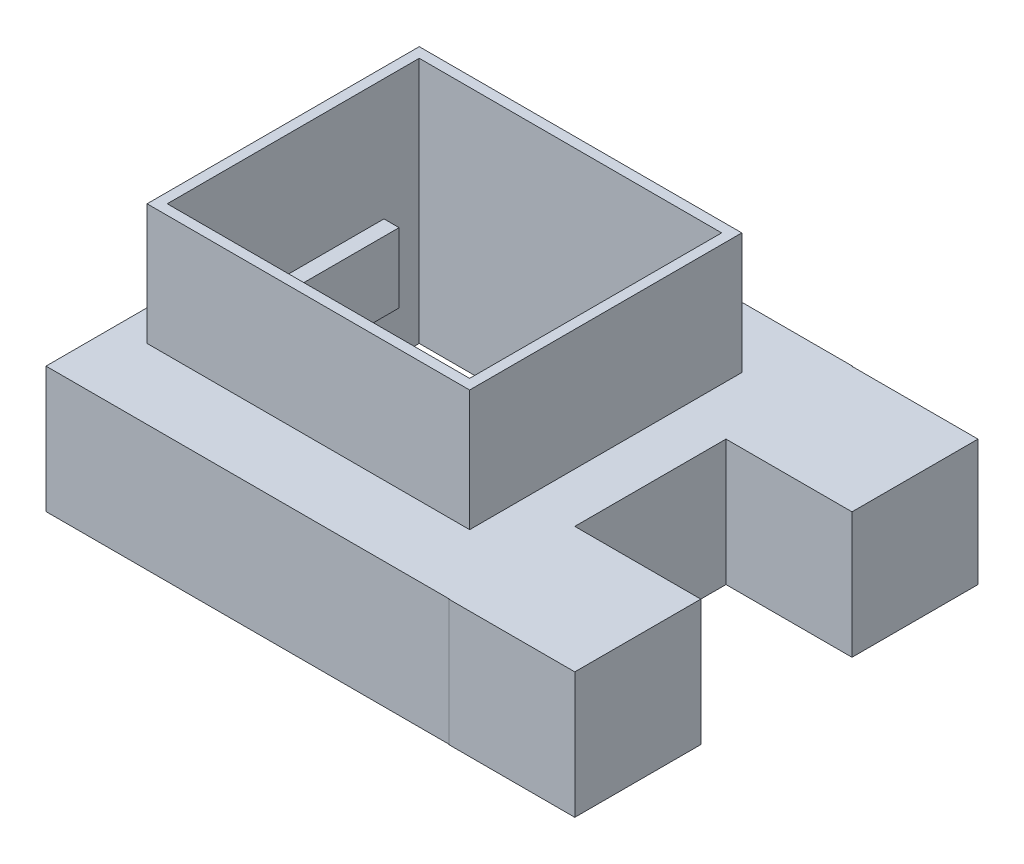
ISO-10303-21;
HEADER;
FILE_DESCRIPTION(('STEP AP214'),'2;1');
FILE_NAME('part.step','',(''),(''),'','','');
FILE_SCHEMA(('AUTOMOTIVE_DESIGN { 1 0 10303 214 1 1 1 1 }'));
ENDSEC;
DATA;
#1=APPLICATION_CONTEXT('core data for automotive mechanical design processes');
#2=APPLICATION_PROTOCOL_DEFINITION('international standard','automotive_design',2000,#1);
#3=PRODUCT_CONTEXT('',#1,'mechanical');
#4=PRODUCT('Part','Part','',(#3));
#5=PRODUCT_RELATED_PRODUCT_CATEGORY('part','',(#4));
#6=PRODUCT_DEFINITION_FORMATION('','',#4);
#7=PRODUCT_DEFINITION_CONTEXT('part definition',#1,'design');
#8=PRODUCT_DEFINITION('design','',#6,#7);
#9=PRODUCT_DEFINITION_SHAPE('','',#8);
#10=(LENGTH_UNIT() NAMED_UNIT(*) SI_UNIT(.MILLI.,.METRE.));
#11=(NAMED_UNIT(*) PLANE_ANGLE_UNIT() SI_UNIT($,.RADIAN.));
#12=(NAMED_UNIT(*) SI_UNIT($,.STERADIAN.) SOLID_ANGLE_UNIT());
#13=UNCERTAINTY_MEASURE_WITH_UNIT(LENGTH_MEASURE(1.E-05),#10,'distance_accuracy_value','');
#14=(GEOMETRIC_REPRESENTATION_CONTEXT(3) GLOBAL_UNCERTAINTY_ASSIGNED_CONTEXT((#13)) GLOBAL_UNIT_ASSIGNED_CONTEXT((#10,
#11,#12)) REPRESENTATION_CONTEXT('',''));
#15=CARTESIAN_POINT('',(0.,0.,0.));
#16=DIRECTION('',(0.,0.,1.));
#17=DIRECTION('',(1.,0.,0.));
#18=AXIS2_PLACEMENT_3D('',#15,#16,#17);
#19=CARTESIAN_POINT('',(-1121.59614728225,739.858247896649,-1949.43739785231));
#20=DIRECTION('',(-1.,0.,0.));
#21=DIRECTION('',(0.,0.,1.));
#22=AXIS2_PLACEMENT_3D('',#19,#20,#21);
#23=PLANE('',#22);
#24=DIRECTION('',(0.,1.,0.));
#25=VECTOR('',#24,1.);
#26=CARTESIAN_POINT('',(-1121.59614728225,739.858247896649,-1949.39662437625));
#27=LINE('',#26,#25);
#28=CARTESIAN_POINT('',(-1121.59614728225,727.358247896649,-1949.39662437625));
#29=VERTEX_POINT('',#28);
#30=CARTESIAN_POINT('',(-1121.59614728225,739.858247896649,-1949.39662437625));
#31=VERTEX_POINT('',#30);
#32=EDGE_CURVE('E257',#29,#31,#27,.T.);
#33=ORIENTED_EDGE('',*,*,#32,.F.);
#34=DIRECTION('',(0.,0.,-1.));
#35=VECTOR('',#34,1.);
#36=CARTESIAN_POINT('',(-1121.59614728225,727.358247896649,-1949.43739785231));
#37=LINE('',#36,#35);
#38=CARTESIAN_POINT('',(-1121.59614728225,727.358247896649,-1949.43739785231));
#39=VERTEX_POINT('',#38);
#40=EDGE_CURVE('E487',#29,#39,#37,.T.);
#41=ORIENTED_EDGE('',*,*,#40,.T.);
#42=DIRECTION('',(0.,-1.,0.));
#43=VECTOR('',#42,1.);
#44=CARTESIAN_POINT('',(-1121.59614728225,739.858247896649,-1949.43739785231));
#45=LINE('',#44,#43);
#46=CARTESIAN_POINT('',(-1121.59614728225,739.858247896649,-1949.43739785231));
#47=VERTEX_POINT('',#46);
#48=EDGE_CURVE('E12',#47,#39,#45,.T.);
#49=ORIENTED_EDGE('',*,*,#48,.F.);
#50=DIRECTION('',(0.,0.,-1.));
#51=VECTOR('',#50,1.);
#52=CARTESIAN_POINT('',(-1121.59614728225,739.858247896649,-1949.43739785231));
#53=LINE('',#52,#51);
#54=EDGE_CURVE('E63',#31,#47,#53,.T.);
#55=ORIENTED_EDGE('',*,*,#54,.F.);
#56=EDGE_LOOP('',(#33,#41,#49,#55));
#57=FACE_BOUND('',#56,.T.);
#58=ADVANCED_FACE('F48',(#57),#23,.F.);
#59=DIRECTION('',(0.,-1.,0.));
#60=VECTOR('',#59,1.);
#61=CARTESIAN_POINT('',(-1121.59614728225,739.858247896649,-1936.89662437625));
#62=LINE('',#61,#60);
#63=CARTESIAN_POINT('',(-1121.59614728225,739.858247896649,-1936.89662437625));
#64=VERTEX_POINT('',#63);
#65=CARTESIAN_POINT('',(-1121.59614728225,727.358247896649,-1936.89662437625));
#66=VERTEX_POINT('',#65);
#67=EDGE_CURVE('E71',#64,#66,#62,.T.);
#68=ORIENTED_EDGE('',*,*,#67,.F.);
#69=CARTESIAN_POINT('',(-1121.59614728225,739.858247896649,-1921.89662437625));
#70=VERTEX_POINT('',#69);
#71=EDGE_CURVE('E488',#70,#64,#53,.T.);
#72=ORIENTED_EDGE('',*,*,#71,.F.);
#73=DIRECTION('',(0.,1.,0.));
#74=VECTOR('',#73,1.);
#75=CARTESIAN_POINT('',(-1121.59614728225,739.858247896649,-1921.89662437625));
#76=LINE('',#75,#74);
#77=CARTESIAN_POINT('',(-1121.59614728225,727.358247896649,-1921.89662437625));
#78=VERTEX_POINT('',#77);
#79=EDGE_CURVE('E259',#78,#70,#76,.T.);
#80=ORIENTED_EDGE('',*,*,#79,.F.);
#81=EDGE_CURVE('E501',#78,#66,#37,.T.);
#82=ORIENTED_EDGE('',*,*,#81,.T.);
#83=EDGE_LOOP('',(#68,#72,#80,#82));
#84=FACE_BOUND('',#83,.T.);
#85=ADVANCED_FACE('F556',(#84),#23,.F.);
#86=CARTESIAN_POINT('',(-1157.52801242835,727.358247896649,-1917.39662437625));
#87=DIRECTION('',(-1.,0.,0.));
#88=DIRECTION('',(0.,0.,1.));
#89=AXIS2_PLACEMENT_3D('',#86,#87,#88);
#90=PLANE('',#89);
#91=DIRECTION('',(0.,0.,1.));
#92=VECTOR('',#91,1.);
#93=CARTESIAN_POINT('',(-1157.52801242835,751.858247896649,-1917.39662437625));
#94=LINE('',#93,#92);
#95=CARTESIAN_POINT('',(-1157.52801242835,751.858247896649,-1942.39662437625));
#96=VERTEX_POINT('',#95);
#97=CARTESIAN_POINT('',(-1157.52801242835,751.858247896649,-1917.39662437625));
#98=VERTEX_POINT('',#97);
#99=EDGE_CURVE('E398',#96,#98,#94,.T.);
#100=ORIENTED_EDGE('',*,*,#99,.T.);
#101=DIRECTION('',(0.,1.,0.));
#102=VECTOR('',#101,1.);
#103=CARTESIAN_POINT('',(-1157.52801242835,727.358247896649,-1917.39662437625));
#104=LINE('',#103,#102);
#105=CARTESIAN_POINT('',(-1157.52801242835,727.358247896649,-1917.39662437625));
#106=VERTEX_POINT('',#105);
#107=EDGE_CURVE('E416',#106,#98,#104,.T.);
#108=ORIENTED_EDGE('',*,*,#107,.F.);
#109=DIRECTION('',(0.,0.,1.));
#110=VECTOR('',#109,1.);
#111=CARTESIAN_POINT('',(-1157.52801242835,727.358247896649,-1917.39662437625));
#112=LINE('',#111,#110);
#113=CARTESIAN_POINT('',(-1157.52801242835,727.358247896649,-1942.39662437625));
#114=VERTEX_POINT('',#113);
#115=EDGE_CURVE('E399',#114,#106,#112,.T.);
#116=ORIENTED_EDGE('',*,*,#115,.F.);
#117=DIRECTION('',(0.,1.,0.));
#118=VECTOR('',#117,1.);
#119=CARTESIAN_POINT('',(-1157.52801242835,727.358247896649,-1942.39662437625));
#120=LINE('',#119,#118);
#121=EDGE_CURVE('E430',#114,#96,#120,.T.);
#122=ORIENTED_EDGE('',*,*,#121,.T.);
#123=EDGE_LOOP('',(#100,#108,#116,#122));
#124=FACE_BOUND('',#123,.T.);
#125=DIRECTION('',(0.,-1.,0.));
#126=VECTOR('',#125,1.);
#127=CARTESIAN_POINT('',(-1157.52801242835,732.908247896649,-1918.89662437625));
#128=LINE('',#127,#126);
#129=CARTESIAN_POINT('',(-1157.52801242835,739.808247896649,-1918.89662437625));
#130=VERTEX_POINT('',#129);
#131=CARTESIAN_POINT('',(-1157.52801242835,732.908247896649,-1918.89662437625));
#132=VERTEX_POINT('',#131);
#133=EDGE_CURVE('E308',#130,#132,#128,.T.);
#134=ORIENTED_EDGE('',*,*,#133,.F.);
#135=DIRECTION('',(0.,0.,1.));
#136=VECTOR('',#135,1.);
#137=CARTESIAN_POINT('',(-1157.52801242835,739.808247896649,-1938.89662437625));
#138=LINE('',#137,#136);
#139=CARTESIAN_POINT('',(-1157.52801242835,739.808247896649,-1938.89662437625));
#140=VERTEX_POINT('',#139);
#141=EDGE_CURVE('E314',#140,#130,#138,.T.);
#142=ORIENTED_EDGE('',*,*,#141,.F.);
#143=DIRECTION('',(0.,1.,0.));
#144=VECTOR('',#143,1.);
#145=CARTESIAN_POINT('',(-1157.52801242835,732.908247896649,-1938.89662437625));
#146=LINE('',#145,#144);
#147=CARTESIAN_POINT('',(-1157.52801242835,732.908247896649,-1938.89662437625));
#148=VERTEX_POINT('',#147);
#149=EDGE_CURVE('E331',#148,#140,#146,.T.);
#150=ORIENTED_EDGE('',*,*,#149,.F.);
#151=DIRECTION('',(0.,0.,-1.));
#152=VECTOR('',#151,1.);
#153=CARTESIAN_POINT('',(-1157.52801242835,732.908247896649,-1938.89662437625));
#154=LINE('',#153,#152);
#155=EDGE_CURVE('E327',#132,#148,#154,.T.);
#156=ORIENTED_EDGE('',*,*,#155,.F.);
#157=EDGE_LOOP('',(#134,#142,#150,#156));
#158=FACE_BOUND('',#157,.T.);
#159=ADVANCED_FACE('F585',(#124,#158),#90,.F.);
#160=CARTESIAN_POINT('',(-1127.52801242835,727.358247896649,-1917.39662437625));
#161=DIRECTION('',(1.,0.,0.));
#162=DIRECTION('',(0.,0.,-1.));
#163=AXIS2_PLACEMENT_3D('',#160,#161,#162);
#164=PLANE('',#163);
#165=DIRECTION('',(0.,0.,-1.));
#166=VECTOR('',#165,1.);
#167=CARTESIAN_POINT('',(-1127.52801242835,751.858247896649,-1917.39662437625));
#168=LINE('',#167,#166);
#169=CARTESIAN_POINT('',(-1127.52801242835,751.858247896649,-1917.39662437625));
#170=VERTEX_POINT('',#169);
#171=CARTESIAN_POINT('',(-1127.52801242835,751.858247896649,-1942.39662437625));
#172=VERTEX_POINT('',#171);
#173=EDGE_CURVE('E423',#170,#172,#168,.T.);
#174=ORIENTED_EDGE('',*,*,#173,.T.);
#175=DIRECTION('',(0.,1.,0.));
#176=VECTOR('',#175,1.);
#177=CARTESIAN_POINT('',(-1127.52801242835,727.358247896649,-1942.39662437625));
#178=LINE('',#177,#176);
#179=CARTESIAN_POINT('',(-1127.52801242835,727.358247896649,-1942.39662437625));
#180=VERTEX_POINT('',#179);
#181=EDGE_CURVE('E434',#180,#172,#178,.T.);
#182=ORIENTED_EDGE('',*,*,#181,.F.);
#183=DIRECTION('',(0.,0.,-1.));
#184=VECTOR('',#183,1.);
#185=CARTESIAN_POINT('',(-1127.52801242835,727.358247896649,-1917.39662437625));
#186=LINE('',#185,#184);
#187=CARTESIAN_POINT('',(-1127.52801242835,727.358247896649,-1917.39662437625));
#188=VERTEX_POINT('',#187);
#189=EDGE_CURVE('E408',#188,#180,#186,.T.);
#190=ORIENTED_EDGE('',*,*,#189,.F.);
#191=DIRECTION('',(0.,1.,0.));
#192=VECTOR('',#191,1.);
#193=CARTESIAN_POINT('',(-1127.52801242835,727.358247896649,-1917.39662437625));
#194=LINE('',#193,#192);
#195=EDGE_CURVE('E437',#188,#170,#194,.T.);
#196=ORIENTED_EDGE('',*,*,#195,.T.);
#197=EDGE_LOOP('',(#174,#182,#190,#196));
#198=FACE_BOUND('',#197,.T.);
#199=DIRECTION('',(0.,-1.,0.));
#200=VECTOR('',#199,1.);
#201=CARTESIAN_POINT('',(-1127.52801242835,732.908247896649,-1938.89662437625));
#202=LINE('',#201,#200);
#203=CARTESIAN_POINT('',(-1127.52801242835,739.808247896649,-1938.89662437625));
#204=VERTEX_POINT('',#203);
#205=CARTESIAN_POINT('',(-1127.52801242835,732.908247896649,-1938.89662437625));
#206=VERTEX_POINT('',#205);
#207=EDGE_CURVE('E353',#204,#206,#202,.T.);
#208=ORIENTED_EDGE('',*,*,#207,.F.);
#209=DIRECTION('',(0.,0.,-1.));
#210=VECTOR('',#209,1.);
#211=CARTESIAN_POINT('',(-1127.52801242835,739.808247896649,-1918.89662437625));
#212=LINE('',#211,#210);
#213=CARTESIAN_POINT('',(-1127.52801242835,739.808247896649,-1918.89662437625));
#214=VERTEX_POINT('',#213);
#215=EDGE_CURVE('E359',#214,#204,#212,.T.);
#216=ORIENTED_EDGE('',*,*,#215,.F.);
#217=DIRECTION('',(0.,1.,0.));
#218=VECTOR('',#217,1.);
#219=CARTESIAN_POINT('',(-1127.52801242835,732.908247896649,-1918.89662437625));
#220=LINE('',#219,#218);
#221=CARTESIAN_POINT('',(-1127.52801242835,732.908247896649,-1918.89662437625));
#222=VERTEX_POINT('',#221);
#223=EDGE_CURVE('E376',#222,#214,#220,.T.);
#224=ORIENTED_EDGE('',*,*,#223,.F.);
#225=DIRECTION('',(0.,0.,1.));
#226=VECTOR('',#225,1.);
#227=CARTESIAN_POINT('',(-1127.52801242835,732.908247896649,-1918.89662437625));
#228=LINE('',#227,#226);
#229=EDGE_CURVE('E372',#206,#222,#228,.T.);
#230=ORIENTED_EDGE('',*,*,#229,.F.);
#231=EDGE_LOOP('',(#208,#216,#224,#230));
#232=FACE_BOUND('',#231,.T.);
#233=ADVANCED_FACE('F590',(#198,#232),#164,.F.);
#234=CARTESIAN_POINT('',(-1161.59614728225,739.858247896649,-1949.43739785231));
#235=DIRECTION('',(0.,0.,1.));
#236=DIRECTION('',(1.,0.,0.));
#237=AXIS2_PLACEMENT_3D('',#234,#235,#236);
#238=PLANE('',#237);
#239=DIRECTION('',(-1.,0.,0.));
#240=VECTOR('',#239,1.);
#241=CARTESIAN_POINT('',(-1161.59614728225,727.358247896649,-1949.43739785231));
#242=LINE('',#241,#240);
#243=CARTESIAN_POINT('',(-1161.59614728225,727.358247896649,-1949.43739785231));
#244=VERTEX_POINT('',#243);
#245=EDGE_CURVE('E504',#39,#244,#242,.T.);
#246=ORIENTED_EDGE('',*,*,#245,.T.);
#247=DIRECTION('',(0.,-1.,0.));
#248=VECTOR('',#247,1.);
#249=CARTESIAN_POINT('',(-1161.59614728225,739.858247896649,-1949.43739785231));
#250=LINE('',#249,#248);
#251=CARTESIAN_POINT('',(-1161.59614728225,739.858247896649,-1949.43739785231));
#252=VERTEX_POINT('',#251);
#253=EDGE_CURVE('E56',#252,#244,#250,.T.);
#254=ORIENTED_EDGE('',*,*,#253,.F.);
#255=DIRECTION('',(-1.,0.,0.));
#256=VECTOR('',#255,1.);
#257=CARTESIAN_POINT('',(-1161.59614728225,739.858247896649,-1949.43739785231));
#258=LINE('',#257,#256);
#259=EDGE_CURVE('E491',#47,#252,#258,.T.);
#260=ORIENTED_EDGE('',*,*,#259,.F.);
#261=ORIENTED_EDGE('',*,*,#48,.T.);
#262=EDGE_LOOP('',(#246,#254,#260,#261));
#263=FACE_BOUND('',#262,.T.);
#264=ADVANCED_FACE('F588',(#263),#238,.F.);
#265=CARTESIAN_POINT('',(-1161.59614728225,739.858247896649,-1949.43739785231));
#266=DIRECTION('',(1.,0.,0.));
#267=DIRECTION('',(0.,0.,-1.));
#268=AXIS2_PLACEMENT_3D('',#265,#266,#267);
#269=PLANE('',#268);
#270=DIRECTION('',(0.,0.,1.));
#271=VECTOR('',#270,1.);
#272=CARTESIAN_POINT('',(-1161.59614728225,727.358247896649,-1949.43739785231));
#273=LINE('',#272,#271);
#274=CARTESIAN_POINT('',(-1161.59614728225,727.358247896649,-1909.43739785231));
#275=VERTEX_POINT('',#274);
#276=EDGE_CURVE('E507',#244,#275,#273,.T.);
#277=ORIENTED_EDGE('',*,*,#276,.T.);
#278=DIRECTION('',(0.,-1.,0.));
#279=VECTOR('',#278,1.);
#280=CARTESIAN_POINT('',(-1161.59614728225,739.858247896649,-1909.43739785231));
#281=LINE('',#280,#279);
#282=CARTESIAN_POINT('',(-1161.59614728225,739.858247896649,-1909.43739785231));
#283=VERTEX_POINT('',#282);
#284=EDGE_CURVE('E516',#283,#275,#281,.T.);
#285=ORIENTED_EDGE('',*,*,#284,.F.);
#286=DIRECTION('',(0.,0.,1.));
#287=VECTOR('',#286,1.);
#288=CARTESIAN_POINT('',(-1161.59614728225,739.858247896649,-1949.43739785231));
#289=LINE('',#288,#287);
#290=EDGE_CURVE('E494',#252,#283,#289,.T.);
#291=ORIENTED_EDGE('',*,*,#290,.F.);
#292=ORIENTED_EDGE('',*,*,#253,.T.);
#293=EDGE_LOOP('',(#277,#285,#291,#292));
#294=FACE_BOUND('',#293,.T.);
#295=ADVANCED_FACE('F525',(#294),#269,.F.);
#296=CARTESIAN_POINT('',(-1161.59614728225,739.858247896649,-1909.43739785231));
#297=DIRECTION('',(0.,0.,-1.));
#298=DIRECTION('',(-1.,0.,0.));
#299=AXIS2_PLACEMENT_3D('',#296,#297,#298);
#300=PLANE('',#299);
#301=DIRECTION('',(1.,0.,0.));
#302=VECTOR('',#301,1.);
#303=CARTESIAN_POINT('',(-1161.59614728225,727.358247896649,-1909.43739785231));
#304=LINE('',#303,#302);
#305=CARTESIAN_POINT('',(-1121.59614728225,727.358247896649,-1909.43739785231));
#306=VERTEX_POINT('',#305);
#307=EDGE_CURVE('E510',#275,#306,#304,.T.);
#308=ORIENTED_EDGE('',*,*,#307,.T.);
#309=DIRECTION('',(0.,-1.,0.));
#310=VECTOR('',#309,1.);
#311=CARTESIAN_POINT('',(-1121.59614728225,739.858247896649,-1909.43739785231));
#312=LINE('',#311,#310);
#313=CARTESIAN_POINT('',(-1121.59614728225,739.858247896649,-1909.43739785231));
#314=VERTEX_POINT('',#313);
#315=EDGE_CURVE('E500',#314,#306,#312,.T.);
#316=ORIENTED_EDGE('',*,*,#315,.F.);
#317=DIRECTION('',(1.,0.,0.));
#318=VECTOR('',#317,1.);
#319=CARTESIAN_POINT('',(-1161.59614728225,739.858247896649,-1909.43739785231));
#320=LINE('',#319,#318);
#321=EDGE_CURVE('E497',#283,#314,#320,.T.);
#322=ORIENTED_EDGE('',*,*,#321,.F.);
#323=ORIENTED_EDGE('',*,*,#284,.T.);
#324=EDGE_LOOP('',(#308,#316,#322,#323));
#325=FACE_BOUND('',#324,.T.);
#326=ADVANCED_FACE('F537',(#325),#300,.F.);
#327=CARTESIAN_POINT('',(-1123.52801242835,739.858247896649,-1909.89662437625));
#328=DIRECTION('',(0.,1.,0.));
#329=DIRECTION('',(0.,0.,1.));
#330=AXIS2_PLACEMENT_3D('',#327,#328,#329);
#331=PLANE('',#330);
#332=DIRECTION('',(0.,0.,1.));
#333=VECTOR('',#332,1.);
#334=CARTESIAN_POINT('',(-1158.52801242835,739.858247896649,-1916.39662437625));
#335=LINE('',#334,#333);
#336=CARTESIAN_POINT('',(-1158.52801242835,739.858247896649,-1943.39662437625));
#337=VERTEX_POINT('',#336);
#338=CARTESIAN_POINT('',(-1158.52801242835,739.858247896649,-1916.39662437625));
#339=VERTEX_POINT('',#338);
#340=EDGE_CURVE('E433',#337,#339,#335,.T.);
#341=ORIENTED_EDGE('',*,*,#340,.F.);
#342=DIRECTION('',(-1.,0.,0.));
#343=VECTOR('',#342,1.);
#344=CARTESIAN_POINT('',(-1126.52801242835,739.858247896649,-1943.39662437625));
#345=LINE('',#344,#343);
#346=CARTESIAN_POINT('',(-1126.52801242835,739.858247896649,-1943.39662437625));
#347=VERTEX_POINT('',#346);
#348=EDGE_CURVE('E448',#347,#337,#345,.T.);
#349=ORIENTED_EDGE('',*,*,#348,.F.);
#350=DIRECTION('',(0.,0.,-1.));
#351=VECTOR('',#350,1.);
#352=CARTESIAN_POINT('',(-1126.52801242835,739.858247896649,-1916.39662437625));
#353=LINE('',#352,#351);
#354=CARTESIAN_POINT('',(-1126.52801242835,739.858247896649,-1916.39662437625));
#355=VERTEX_POINT('',#354);
#356=EDGE_CURVE('E465',#355,#347,#353,.T.);
#357=ORIENTED_EDGE('',*,*,#356,.F.);
#358=DIRECTION('',(1.,0.,0.));
#359=VECTOR('',#358,1.);
#360=CARTESIAN_POINT('',(-1126.52801242835,739.858247896649,-1916.39662437625));
#361=LINE('',#360,#359);
#362=EDGE_CURVE('E461',#339,#355,#361,.T.);
#363=ORIENTED_EDGE('',*,*,#362,.F.);
#364=EDGE_LOOP('',(#341,#349,#357,#363));
#365=FACE_BOUND('',#364,.T.);
#366=ORIENTED_EDGE('',*,*,#321,.T.);
#367=DIRECTION('',(0.,0.,1.));
#368=VECTOR('',#367,1.);
#369=CARTESIAN_POINT('',(-1121.59614728225,739.858247896649,-1909.39662437625));
#370=LINE('',#369,#368);
#371=CARTESIAN_POINT('',(-1121.59614728225,739.858247896649,-1909.39662437625));
#372=VERTEX_POINT('',#371);
#373=EDGE_CURVE('E264',#314,#372,#370,.T.);
#374=ORIENTED_EDGE('',*,*,#373,.T.);
#375=DIRECTION('',(-1.,0.,0.));
#376=VECTOR('',#375,1.);
#377=CARTESIAN_POINT('',(-1109.09614728225,739.858247896649,-1909.39662437625));
#378=LINE('',#377,#376);
#379=CARTESIAN_POINT('',(-1109.09614728225,739.858247896649,-1909.39662437625));
#380=VERTEX_POINT('',#379);
#381=EDGE_CURVE('E300',#380,#372,#378,.T.);
#382=ORIENTED_EDGE('',*,*,#381,.F.);
#383=DIRECTION('',(0.,0.,1.));
#384=VECTOR('',#383,1.);
#385=CARTESIAN_POINT('',(-1109.09614728225,739.858247896649,-1909.39662437625));
#386=LINE('',#385,#384);
#387=CARTESIAN_POINT('',(-1109.09614728225,739.858247896649,-1921.89662437625));
#388=VERTEX_POINT('',#387);
#389=EDGE_CURVE('E274',#388,#380,#386,.T.);
#390=ORIENTED_EDGE('',*,*,#389,.F.);
#391=DIRECTION('',(-1.,0.,0.));
#392=VECTOR('',#391,1.);
#393=CARTESIAN_POINT('',(-1109.09614728225,739.858247896649,-1921.89662437625));
#394=LINE('',#393,#392);
#395=EDGE_CURVE('E304',#388,#70,#394,.T.);
#396=ORIENTED_EDGE('',*,*,#395,.T.);
#397=ORIENTED_EDGE('',*,*,#71,.T.);
#398=DIRECTION('',(-1.,0.,0.));
#399=VECTOR('',#398,1.);
#400=CARTESIAN_POINT('',(-1109.09614728225,739.858247896649,-1936.89662437625));
#401=LINE('',#400,#399);
#402=CARTESIAN_POINT('',(-1109.09614728225,739.858247896649,-1936.89662437625));
#403=VERTEX_POINT('',#402);
#404=EDGE_CURVE('E240',#403,#64,#401,.T.);
#405=ORIENTED_EDGE('',*,*,#404,.F.);
#406=DIRECTION('',(0.,0.,1.));
#407=VECTOR('',#406,1.);
#408=CARTESIAN_POINT('',(-1109.09614728225,739.858247896649,-1936.89662437625));
#409=LINE('',#408,#407);
#410=CARTESIAN_POINT('',(-1109.09614728225,739.858247896649,-1949.39662437625));
#411=VERTEX_POINT('',#410);
#412=EDGE_CURVE('E233',#411,#403,#409,.T.);
#413=ORIENTED_EDGE('',*,*,#412,.F.);
#414=DIRECTION('',(-1.,0.,0.));
#415=VECTOR('',#414,1.);
#416=CARTESIAN_POINT('',(-1109.09614728225,739.858247896649,-1949.39662437625));
#417=LINE('',#416,#415);
#418=EDGE_CURVE('E237',#411,#31,#417,.T.);
#419=ORIENTED_EDGE('',*,*,#418,.T.);
#420=ORIENTED_EDGE('',*,*,#54,.T.);
#421=ORIENTED_EDGE('',*,*,#259,.T.);
#422=ORIENTED_EDGE('',*,*,#290,.T.);
#423=EDGE_LOOP('',(#366,#374,#382,#390,#396,#397,#405,#413,#419,#420,#421,#422));
#424=FACE_BOUND('',#423,.T.);
#425=ADVANCED_FACE('F235',(#365,#424),#331,.T.);
#426=CARTESIAN_POINT('',(-1123.52801242835,727.358247896649,-1909.89662437625));
#427=DIRECTION('',(0.,1.,0.));
#428=DIRECTION('',(0.,0.,1.));
#429=AXIS2_PLACEMENT_3D('',#426,#427,#428);
#430=PLANE('',#429);
#431=DIRECTION('',(-1.,0.,0.));
#432=VECTOR('',#431,1.);
#433=CARTESIAN_POINT('',(-1127.52801242835,727.358247896649,-1942.39662437625));
#434=LINE('',#433,#432);
#435=EDGE_CURVE('E412',#180,#114,#434,.T.);
#436=ORIENTED_EDGE('',*,*,#435,.T.);
#437=ORIENTED_EDGE('',*,*,#115,.T.);
#438=DIRECTION('',(1.,0.,0.));
#439=VECTOR('',#438,1.);
#440=CARTESIAN_POINT('',(-1127.52801242835,727.358247896649,-1917.39662437625));
#441=LINE('',#440,#439);
#442=EDGE_CURVE('E403',#106,#188,#441,.T.);
#443=ORIENTED_EDGE('',*,*,#442,.T.);
#444=ORIENTED_EDGE('',*,*,#189,.T.);
#445=EDGE_LOOP('',(#436,#437,#443,#444));
#446=FACE_BOUND('',#445,.T.);
#447=ORIENTED_EDGE('',*,*,#81,.F.);
#448=DIRECTION('',(-1.,0.,0.));
#449=VECTOR('',#448,1.);
#450=CARTESIAN_POINT('',(-1109.09614728225,727.358247896649,-1921.89662437625));
#451=LINE('',#450,#449);
#452=CARTESIAN_POINT('',(-1109.09614728225,727.358247896649,-1921.89662437625));
#453=VERTEX_POINT('',#452);
#454=EDGE_CURVE('E283',#453,#78,#451,.T.);
#455=ORIENTED_EDGE('',*,*,#454,.F.);
#456=DIRECTION('',(0.,0.,-1.));
#457=VECTOR('',#456,1.);
#458=CARTESIAN_POINT('',(-1109.09614728225,727.358247896649,-1909.39662437625));
#459=LINE('',#458,#457);
#460=CARTESIAN_POINT('',(-1109.09614728225,727.358247896649,-1909.39662437625));
#461=VERTEX_POINT('',#460);
#462=EDGE_CURVE('E281',#461,#453,#459,.T.);
#463=ORIENTED_EDGE('',*,*,#462,.F.);
#464=DIRECTION('',(-1.,0.,0.));
#465=VECTOR('',#464,1.);
#466=CARTESIAN_POINT('',(-1109.09614728225,727.358247896649,-1909.39662437625));
#467=LINE('',#466,#465);
#468=CARTESIAN_POINT('',(-1121.59614728225,727.358247896649,-1909.39662437625));
#469=VERTEX_POINT('',#468);
#470=EDGE_CURVE('E296',#461,#469,#467,.T.);
#471=ORIENTED_EDGE('',*,*,#470,.T.);
#472=DIRECTION('',(0.,0.,-1.));
#473=VECTOR('',#472,1.);
#474=CARTESIAN_POINT('',(-1121.59614728225,727.358247896649,-1909.39662437625));
#475=LINE('',#474,#473);
#476=EDGE_CURVE('E275',#469,#306,#475,.T.);
#477=ORIENTED_EDGE('',*,*,#476,.T.);
#478=ORIENTED_EDGE('',*,*,#307,.F.);
#479=ORIENTED_EDGE('',*,*,#276,.F.);
#480=ORIENTED_EDGE('',*,*,#245,.F.);
#481=ORIENTED_EDGE('',*,*,#40,.F.);
#482=DIRECTION('',(-1.,0.,0.));
#483=VECTOR('',#482,1.);
#484=CARTESIAN_POINT('',(-1109.09614728225,727.358247896649,-1949.39662437625));
#485=LINE('',#484,#483);
#486=CARTESIAN_POINT('',(-1109.09614728225,727.358247896649,-1949.39662437625));
#487=VERTEX_POINT('',#486);
#488=EDGE_CURVE('E561',#487,#29,#485,.T.);
#489=ORIENTED_EDGE('',*,*,#488,.F.);
#490=DIRECTION('',(0.,0.,-1.));
#491=VECTOR('',#490,1.);
#492=CARTESIAN_POINT('',(-1109.09614728225,727.358247896649,-1936.89662437625));
#493=LINE('',#492,#491);
#494=CARTESIAN_POINT('',(-1109.09614728225,727.358247896649,-1936.89662437625));
#495=VERTEX_POINT('',#494);
#496=EDGE_CURVE('E250',#495,#487,#493,.T.);
#497=ORIENTED_EDGE('',*,*,#496,.F.);
#498=DIRECTION('',(-1.,0.,0.));
#499=VECTOR('',#498,1.);
#500=CARTESIAN_POINT('',(-1109.09614728225,727.358247896649,-1936.89662437625));
#501=LINE('',#500,#499);
#502=EDGE_CURVE('E266',#495,#66,#501,.T.);
#503=ORIENTED_EDGE('',*,*,#502,.T.);
#504=EDGE_LOOP('',(#447,#455,#463,#471,#477,#478,#479,#480,#481,#489,#497,#503));
#505=FACE_BOUND('',#504,.T.);
#506=ADVANCED_FACE('F533',(#446,#505),#430,.F.);
#507=CARTESIAN_POINT('',(-1158.52801242835,751.858247896649,-1916.39662437625));
#508=DIRECTION('',(1.,0.,0.));
#509=DIRECTION('',(0.,0.,-1.));
#510=AXIS2_PLACEMENT_3D('',#507,#508,#509);
#511=PLANE('',#510);
#512=ORIENTED_EDGE('',*,*,#340,.T.);
#513=DIRECTION('',(0.,-1.,0.));
#514=VECTOR('',#513,1.);
#515=CARTESIAN_POINT('',(-1158.52801242835,751.858247896649,-1916.39662437625));
#516=LINE('',#515,#514);
#517=CARTESIAN_POINT('',(-1158.52801242835,751.858247896649,-1916.39662437625));
#518=VERTEX_POINT('',#517);
#519=EDGE_CURVE('E483',#518,#339,#516,.T.);
#520=ORIENTED_EDGE('',*,*,#519,.F.);
#521=DIRECTION('',(0.,0.,1.));
#522=VECTOR('',#521,1.);
#523=CARTESIAN_POINT('',(-1158.52801242835,751.858247896649,-1916.39662437625));
#524=LINE('',#523,#522);
#525=CARTESIAN_POINT('',(-1158.52801242835,751.858247896649,-1943.39662437625));
#526=VERTEX_POINT('',#525);
#527=EDGE_CURVE('E443',#526,#518,#524,.T.);
#528=ORIENTED_EDGE('',*,*,#527,.F.);
#529=DIRECTION('',(0.,-1.,0.));
#530=VECTOR('',#529,1.);
#531=CARTESIAN_POINT('',(-1158.52801242835,751.858247896649,-1943.39662437625));
#532=LINE('',#531,#530);
#533=EDGE_CURVE('E457',#526,#337,#532,.T.);
#534=ORIENTED_EDGE('',*,*,#533,.T.);
#535=EDGE_LOOP('',(#512,#520,#528,#534));
#536=FACE_BOUND('',#535,.T.);
#537=ADVANCED_FACE('F603',(#536),#511,.F.);
#538=CARTESIAN_POINT('',(-1126.52801242835,751.858247896649,-1916.39662437625));
#539=DIRECTION('',(0.,0.,-1.));
#540=DIRECTION('',(-1.,0.,0.));
#541=AXIS2_PLACEMENT_3D('',#538,#539,#540);
#542=PLANE('',#541);
#543=ORIENTED_EDGE('',*,*,#362,.T.);
#544=DIRECTION('',(0.,-1.,0.));
#545=VECTOR('',#544,1.);
#546=CARTESIAN_POINT('',(-1126.52801242835,751.858247896649,-1916.39662437625));
#547=LINE('',#546,#545);
#548=CARTESIAN_POINT('',(-1126.52801242835,751.858247896649,-1916.39662437625));
#549=VERTEX_POINT('',#548);
#550=EDGE_CURVE('E479',#549,#355,#547,.T.);
#551=ORIENTED_EDGE('',*,*,#550,.F.);
#552=DIRECTION('',(1.,0.,0.));
#553=VECTOR('',#552,1.);
#554=CARTESIAN_POINT('',(-1126.52801242835,751.858247896649,-1916.39662437625));
#555=LINE('',#554,#553);
#556=EDGE_CURVE('E447',#518,#549,#555,.T.);
#557=ORIENTED_EDGE('',*,*,#556,.F.);
#558=ORIENTED_EDGE('',*,*,#519,.T.);
#559=EDGE_LOOP('',(#543,#551,#557,#558));
#560=FACE_BOUND('',#559,.T.);
#561=ADVANCED_FACE('F610',(#560),#542,.F.);
#562=CARTESIAN_POINT('',(-1126.52801242835,751.858247896649,-1916.39662437625));
#563=DIRECTION('',(-1.,0.,0.));
#564=DIRECTION('',(0.,0.,1.));
#565=AXIS2_PLACEMENT_3D('',#562,#563,#564);
#566=PLANE('',#565);
#567=ORIENTED_EDGE('',*,*,#356,.T.);
#568=DIRECTION('',(0.,-1.,0.));
#569=VECTOR('',#568,1.);
#570=CARTESIAN_POINT('',(-1126.52801242835,751.858247896649,-1943.39662437625));
#571=LINE('',#570,#569);
#572=CARTESIAN_POINT('',(-1126.52801242835,751.858247896649,-1943.39662437625));
#573=VERTEX_POINT('',#572);
#574=EDGE_CURVE('E475',#573,#347,#571,.T.);
#575=ORIENTED_EDGE('',*,*,#574,.F.);
#576=DIRECTION('',(0.,0.,-1.));
#577=VECTOR('',#576,1.);
#578=CARTESIAN_POINT('',(-1126.52801242835,751.858247896649,-1916.39662437625));
#579=LINE('',#578,#577);
#580=EDGE_CURVE('E451',#549,#573,#579,.T.);
#581=ORIENTED_EDGE('',*,*,#580,.F.);
#582=ORIENTED_EDGE('',*,*,#550,.T.);
#583=EDGE_LOOP('',(#567,#575,#581,#582));
#584=FACE_BOUND('',#583,.T.);
#585=ADVANCED_FACE('F614',(#584),#566,.F.);
#586=CARTESIAN_POINT('',(-1126.52801242835,751.858247896649,-1943.39662437625));
#587=DIRECTION('',(0.,0.,1.));
#588=DIRECTION('',(1.,0.,0.));
#589=AXIS2_PLACEMENT_3D('',#586,#587,#588);
#590=PLANE('',#589);
#591=ORIENTED_EDGE('',*,*,#348,.T.);
#592=ORIENTED_EDGE('',*,*,#533,.F.);
#593=DIRECTION('',(-1.,0.,0.));
#594=VECTOR('',#593,1.);
#595=CARTESIAN_POINT('',(-1126.52801242835,751.858247896649,-1943.39662437625));
#596=LINE('',#595,#594);
#597=EDGE_CURVE('E454',#573,#526,#596,.T.);
#598=ORIENTED_EDGE('',*,*,#597,.F.);
#599=ORIENTED_EDGE('',*,*,#574,.T.);
#600=EDGE_LOOP('',(#591,#592,#598,#599));
#601=FACE_BOUND('',#600,.T.);
#602=ADVANCED_FACE('F618',(#601),#590,.F.);
#603=CARTESIAN_POINT('',(-1123.52801242835,751.858247896649,-1909.89662437625));
#604=DIRECTION('',(0.,1.,0.));
#605=DIRECTION('',(0.,0.,1.));
#606=AXIS2_PLACEMENT_3D('',#603,#604,#605);
#607=PLANE('',#606);
#608=ORIENTED_EDGE('',*,*,#99,.F.);
#609=DIRECTION('',(-1.,0.,0.));
#610=VECTOR('',#609,1.);
#611=CARTESIAN_POINT('',(-1127.52801242835,751.858247896649,-1942.39662437625));
#612=LINE('',#611,#610);
#613=EDGE_CURVE('E404',#172,#96,#612,.T.);
#614=ORIENTED_EDGE('',*,*,#613,.F.);
#615=ORIENTED_EDGE('',*,*,#173,.F.);
#616=DIRECTION('',(1.,0.,0.));
#617=VECTOR('',#616,1.);
#618=CARTESIAN_POINT('',(-1127.52801242835,751.858247896649,-1917.39662437625));
#619=LINE('',#618,#617);
#620=EDGE_CURVE('E419',#98,#170,#619,.T.);
#621=ORIENTED_EDGE('',*,*,#620,.F.);
#622=EDGE_LOOP('',(#608,#614,#615,#621));
#623=FACE_BOUND('',#622,.T.);
#624=ORIENTED_EDGE('',*,*,#527,.T.);
#625=ORIENTED_EDGE('',*,*,#556,.T.);
#626=ORIENTED_EDGE('',*,*,#580,.T.);
#627=ORIENTED_EDGE('',*,*,#597,.T.);
#628=EDGE_LOOP('',(#624,#625,#626,#627));
#629=FACE_BOUND('',#628,.T.);
#630=ADVANCED_FACE('F622',(#623,#629),#607,.T.);
#631=CARTESIAN_POINT('',(-1127.52801242835,727.358247896649,-1942.39662437625));
#632=DIRECTION('',(0.,0.,-1.));
#633=DIRECTION('',(-1.,0.,0.));
#634=AXIS2_PLACEMENT_3D('',#631,#632,#633);
#635=PLANE('',#634);
#636=ORIENTED_EDGE('',*,*,#613,.T.);
#637=ORIENTED_EDGE('',*,*,#121,.F.);
#638=ORIENTED_EDGE('',*,*,#435,.F.);
#639=ORIENTED_EDGE('',*,*,#181,.T.);
#640=EDGE_LOOP('',(#636,#637,#638,#639));
#641=FACE_BOUND('',#640,.T.);
#642=ADVANCED_FACE('F626',(#641),#635,.F.);
#643=CARTESIAN_POINT('',(-1127.52801242835,727.358247896649,-1917.39662437625));
#644=DIRECTION('',(0.,0.,1.));
#645=DIRECTION('',(1.,0.,0.));
#646=AXIS2_PLACEMENT_3D('',#643,#644,#645);
#647=PLANE('',#646);
#648=ORIENTED_EDGE('',*,*,#620,.T.);
#649=ORIENTED_EDGE('',*,*,#195,.F.);
#650=ORIENTED_EDGE('',*,*,#442,.F.);
#651=ORIENTED_EDGE('',*,*,#107,.T.);
#652=EDGE_LOOP('',(#648,#649,#650,#651));
#653=FACE_BOUND('',#652,.T.);
#654=ADVANCED_FACE('F631',(#653),#647,.F.);
#655=CARTESIAN_POINT('',(-1129.02801242835,732.908247896649,-1938.89662437625));
#656=DIRECTION('',(0.,0.,1.));
#657=DIRECTION('',(1.,0.,0.));
#658=AXIS2_PLACEMENT_3D('',#655,#656,#657);
#659=PLANE('',#658);
#660=ORIENTED_EDGE('',*,*,#207,.T.);
#661=DIRECTION('',(1.,0.,0.));
#662=VECTOR('',#661,1.);
#663=CARTESIAN_POINT('',(-1129.02801242835,732.908247896649,-1938.89662437625));
#664=LINE('',#663,#662);
#665=CARTESIAN_POINT('',(-1129.02801242835,732.908247896649,-1938.89662437625));
#666=VERTEX_POINT('',#665);
#667=EDGE_CURVE('E394',#666,#206,#664,.T.);
#668=ORIENTED_EDGE('',*,*,#667,.F.);
#669=DIRECTION('',(0.,-1.,0.));
#670=VECTOR('',#669,1.);
#671=CARTESIAN_POINT('',(-1129.02801242835,732.908247896649,-1938.89662437625));
#672=LINE('',#671,#670);
#673=CARTESIAN_POINT('',(-1129.02801242835,739.808247896649,-1938.89662437625));
#674=VERTEX_POINT('',#673);
#675=EDGE_CURVE('E354',#674,#666,#672,.T.);
#676=ORIENTED_EDGE('',*,*,#675,.F.);
#677=DIRECTION('',(1.,0.,0.));
#678=VECTOR('',#677,1.);
#679=CARTESIAN_POINT('',(-1129.02801242835,739.808247896649,-1938.89662437625));
#680=LINE('',#679,#678);
#681=EDGE_CURVE('E368',#674,#204,#680,.T.);
#682=ORIENTED_EDGE('',*,*,#681,.T.);
#683=EDGE_LOOP('',(#660,#668,#676,#682));
#684=FACE_BOUND('',#683,.T.);
#685=ADVANCED_FACE('F633',(#684),#659,.F.);
#686=CARTESIAN_POINT('',(-1129.02801242835,732.908247896649,-1918.89662437625));
#687=DIRECTION('',(0.,1.,0.));
#688=DIRECTION('',(0.,0.,1.));
#689=AXIS2_PLACEMENT_3D('',#686,#687,#688);
#690=PLANE('',#689);
#691=ORIENTED_EDGE('',*,*,#229,.T.);
#692=DIRECTION('',(1.,0.,0.));
#693=VECTOR('',#692,1.);
#694=CARTESIAN_POINT('',(-1129.02801242835,732.908247896649,-1918.89662437625));
#695=LINE('',#694,#693);
#696=CARTESIAN_POINT('',(-1129.02801242835,732.908247896649,-1918.89662437625));
#697=VERTEX_POINT('',#696);
#698=EDGE_CURVE('E390',#697,#222,#695,.T.);
#699=ORIENTED_EDGE('',*,*,#698,.F.);
#700=DIRECTION('',(0.,0.,1.));
#701=VECTOR('',#700,1.);
#702=CARTESIAN_POINT('',(-1129.02801242835,732.908247896649,-1918.89662437625));
#703=LINE('',#702,#701);
#704=EDGE_CURVE('E358',#666,#697,#703,.T.);
#705=ORIENTED_EDGE('',*,*,#704,.F.);
#706=ORIENTED_EDGE('',*,*,#667,.T.);
#707=EDGE_LOOP('',(#691,#699,#705,#706));
#708=FACE_BOUND('',#707,.T.);
#709=ADVANCED_FACE('F641',(#708),#690,.F.);
#710=CARTESIAN_POINT('',(-1129.02801242835,732.908247896649,-1918.89662437625));
#711=DIRECTION('',(0.,0.,-1.));
#712=DIRECTION('',(-1.,0.,0.));
#713=AXIS2_PLACEMENT_3D('',#710,#711,#712);
#714=PLANE('',#713);
#715=ORIENTED_EDGE('',*,*,#223,.T.);
#716=DIRECTION('',(1.,0.,0.));
#717=VECTOR('',#716,1.);
#718=CARTESIAN_POINT('',(-1129.02801242835,739.808247896649,-1918.89662437625));
#719=LINE('',#718,#717);
#720=CARTESIAN_POINT('',(-1129.02801242835,739.808247896649,-1918.89662437625));
#721=VERTEX_POINT('',#720);
#722=EDGE_CURVE('E386',#721,#214,#719,.T.);
#723=ORIENTED_EDGE('',*,*,#722,.F.);
#724=DIRECTION('',(0.,1.,0.));
#725=VECTOR('',#724,1.);
#726=CARTESIAN_POINT('',(-1129.02801242835,732.908247896649,-1918.89662437625));
#727=LINE('',#726,#725);
#728=EDGE_CURVE('E362',#697,#721,#727,.T.);
#729=ORIENTED_EDGE('',*,*,#728,.F.);
#730=ORIENTED_EDGE('',*,*,#698,.T.);
#731=EDGE_LOOP('',(#715,#723,#729,#730));
#732=FACE_BOUND('',#731,.T.);
#733=ADVANCED_FACE('F645',(#732),#714,.F.);
#734=CARTESIAN_POINT('',(-1129.02801242835,739.808247896649,-1918.89662437625));
#735=DIRECTION('',(0.,-1.,0.));
#736=DIRECTION('',(0.,0.,-1.));
#737=AXIS2_PLACEMENT_3D('',#734,#735,#736);
#738=PLANE('',#737);
#739=ORIENTED_EDGE('',*,*,#215,.T.);
#740=ORIENTED_EDGE('',*,*,#681,.F.);
#741=DIRECTION('',(0.,0.,-1.));
#742=VECTOR('',#741,1.);
#743=CARTESIAN_POINT('',(-1129.02801242835,739.808247896649,-1918.89662437625));
#744=LINE('',#743,#742);
#745=EDGE_CURVE('E365',#721,#674,#744,.T.);
#746=ORIENTED_EDGE('',*,*,#745,.F.);
#747=ORIENTED_EDGE('',*,*,#722,.T.);
#748=EDGE_LOOP('',(#739,#740,#746,#747));
#749=FACE_BOUND('',#748,.T.);
#750=ADVANCED_FACE('F649',(#749),#738,.F.);
#751=CARTESIAN_POINT('',(-1129.02801242835,727.358247896649,-1909.89662437625));
#752=DIRECTION('',(-1.,0.,0.));
#753=DIRECTION('',(0.,0.,1.));
#754=AXIS2_PLACEMENT_3D('',#751,#752,#753);
#755=PLANE('',#754);
#756=ORIENTED_EDGE('',*,*,#675,.T.);
#757=ORIENTED_EDGE('',*,*,#704,.T.);
#758=ORIENTED_EDGE('',*,*,#728,.T.);
#759=ORIENTED_EDGE('',*,*,#745,.T.);
#760=EDGE_LOOP('',(#756,#757,#758,#759));
#761=FACE_BOUND('',#760,.T.);
#762=ADVANCED_FACE('F653',(#761),#755,.T.);
#763=CARTESIAN_POINT('',(-1156.02801242835,732.908247896649,-1918.89662437625));
#764=DIRECTION('',(0.,0.,-1.));
#765=DIRECTION('',(-1.,0.,0.));
#766=AXIS2_PLACEMENT_3D('',#763,#764,#765);
#767=PLANE('',#766);
#768=ORIENTED_EDGE('',*,*,#133,.T.);
#769=DIRECTION('',(-1.,0.,0.));
#770=VECTOR('',#769,1.);
#771=CARTESIAN_POINT('',(-1156.02801242835,732.908247896649,-1918.89662437625));
#772=LINE('',#771,#770);
#773=CARTESIAN_POINT('',(-1156.02801242835,732.908247896649,-1918.89662437625));
#774=VERTEX_POINT('',#773);
#775=EDGE_CURVE('E349',#774,#132,#772,.T.);
#776=ORIENTED_EDGE('',*,*,#775,.F.);
#777=DIRECTION('',(0.,-1.,0.));
#778=VECTOR('',#777,1.);
#779=CARTESIAN_POINT('',(-1156.02801242835,732.908247896649,-1918.89662437625));
#780=LINE('',#779,#778);
#781=CARTESIAN_POINT('',(-1156.02801242835,739.808247896649,-1918.89662437625));
#782=VERTEX_POINT('',#781);
#783=EDGE_CURVE('E309',#782,#774,#780,.T.);
#784=ORIENTED_EDGE('',*,*,#783,.F.);
#785=DIRECTION('',(-1.,0.,0.));
#786=VECTOR('',#785,1.);
#787=CARTESIAN_POINT('',(-1156.02801242835,739.808247896649,-1918.89662437625));
#788=LINE('',#787,#786);
#789=EDGE_CURVE('E323',#782,#130,#788,.T.);
#790=ORIENTED_EDGE('',*,*,#789,.T.);
#791=EDGE_LOOP('',(#768,#776,#784,#790));
#792=FACE_BOUND('',#791,.T.);
#793=ADVANCED_FACE('F657',(#792),#767,.F.);
#794=CARTESIAN_POINT('',(-1156.02801242835,732.908247896649,-1938.89662437625));
#795=DIRECTION('',(0.,1.,0.));
#796=DIRECTION('',(0.,0.,1.));
#797=AXIS2_PLACEMENT_3D('',#794,#795,#796);
#798=PLANE('',#797);
#799=ORIENTED_EDGE('',*,*,#155,.T.);
#800=DIRECTION('',(-1.,0.,0.));
#801=VECTOR('',#800,1.);
#802=CARTESIAN_POINT('',(-1156.02801242835,732.908247896649,-1938.89662437625));
#803=LINE('',#802,#801);
#804=CARTESIAN_POINT('',(-1156.02801242835,732.908247896649,-1938.89662437625));
#805=VERTEX_POINT('',#804);
#806=EDGE_CURVE('E345',#805,#148,#803,.T.);
#807=ORIENTED_EDGE('',*,*,#806,.F.);
#808=DIRECTION('',(0.,0.,-1.));
#809=VECTOR('',#808,1.);
#810=CARTESIAN_POINT('',(-1156.02801242835,732.908247896649,-1938.89662437625));
#811=LINE('',#810,#809);
#812=EDGE_CURVE('E313',#774,#805,#811,.T.);
#813=ORIENTED_EDGE('',*,*,#812,.F.);
#814=ORIENTED_EDGE('',*,*,#775,.T.);
#815=EDGE_LOOP('',(#799,#807,#813,#814));
#816=FACE_BOUND('',#815,.T.);
#817=ADVANCED_FACE('F661',(#816),#798,.F.);
#818=CARTESIAN_POINT('',(-1156.02801242835,732.908247896649,-1938.89662437625));
#819=DIRECTION('',(0.,0.,1.));
#820=DIRECTION('',(1.,0.,0.));
#821=AXIS2_PLACEMENT_3D('',#818,#819,#820);
#822=PLANE('',#821);
#823=ORIENTED_EDGE('',*,*,#149,.T.);
#824=DIRECTION('',(-1.,0.,0.));
#825=VECTOR('',#824,1.);
#826=CARTESIAN_POINT('',(-1156.02801242835,739.808247896649,-1938.89662437625));
#827=LINE('',#826,#825);
#828=CARTESIAN_POINT('',(-1156.02801242835,739.808247896649,-1938.89662437625));
#829=VERTEX_POINT('',#828);
#830=EDGE_CURVE('E341',#829,#140,#827,.T.);
#831=ORIENTED_EDGE('',*,*,#830,.F.);
#832=DIRECTION('',(0.,1.,0.));
#833=VECTOR('',#832,1.);
#834=CARTESIAN_POINT('',(-1156.02801242835,732.908247896649,-1938.89662437625));
#835=LINE('',#834,#833);
#836=EDGE_CURVE('E317',#805,#829,#835,.T.);
#837=ORIENTED_EDGE('',*,*,#836,.F.);
#838=ORIENTED_EDGE('',*,*,#806,.T.);
#839=EDGE_LOOP('',(#823,#831,#837,#838));
#840=FACE_BOUND('',#839,.T.);
#841=ADVANCED_FACE('F665',(#840),#822,.F.);
#842=CARTESIAN_POINT('',(-1156.02801242835,739.808247896649,-1938.89662437625));
#843=DIRECTION('',(0.,-1.,0.));
#844=DIRECTION('',(0.,0.,-1.));
#845=AXIS2_PLACEMENT_3D('',#842,#843,#844);
#846=PLANE('',#845);
#847=ORIENTED_EDGE('',*,*,#141,.T.);
#848=ORIENTED_EDGE('',*,*,#789,.F.);
#849=DIRECTION('',(0.,0.,1.));
#850=VECTOR('',#849,1.);
#851=CARTESIAN_POINT('',(-1156.02801242835,739.808247896649,-1938.89662437625));
#852=LINE('',#851,#850);
#853=EDGE_CURVE('E320',#829,#782,#852,.T.);
#854=ORIENTED_EDGE('',*,*,#853,.F.);
#855=ORIENTED_EDGE('',*,*,#830,.T.);
#856=EDGE_LOOP('',(#847,#848,#854,#855));
#857=FACE_BOUND('',#856,.T.);
#858=ADVANCED_FACE('F669',(#857),#846,.F.);
#859=CARTESIAN_POINT('',(-1156.02801242835,727.358247896649,-1909.89662437625));
#860=DIRECTION('',(1.,0.,0.));
#861=DIRECTION('',(0.,0.,-1.));
#862=AXIS2_PLACEMENT_3D('',#859,#860,#861);
#863=PLANE('',#862);
#864=ORIENTED_EDGE('',*,*,#783,.T.);
#865=ORIENTED_EDGE('',*,*,#812,.T.);
#866=ORIENTED_EDGE('',*,*,#836,.T.);
#867=ORIENTED_EDGE('',*,*,#853,.T.);
#868=EDGE_LOOP('',(#864,#865,#866,#867));
#869=FACE_BOUND('',#868,.T.);
#870=ADVANCED_FACE('F673',(#869),#863,.T.);
#871=CARTESIAN_POINT('',(-1121.59614728225,727.358247896649,-1909.89662437625));
#872=DIRECTION('',(1.,0.,0.));
#873=DIRECTION('',(0.,0.,-1.));
#874=AXIS2_PLACEMENT_3D('',#871,#872,#873);
#875=PLANE('',#874);
#876=ORIENTED_EDGE('',*,*,#373,.F.);
#877=ORIENTED_EDGE('',*,*,#315,.T.);
#878=ORIENTED_EDGE('',*,*,#476,.F.);
#879=DIRECTION('',(0.,-1.,0.));
#880=VECTOR('',#879,1.);
#881=CARTESIAN_POINT('',(-1121.59614728225,739.858247896649,-1909.39662437625));
#882=LINE('',#881,#880);
#883=EDGE_CURVE('E287',#372,#469,#882,.T.);
#884=ORIENTED_EDGE('',*,*,#883,.F.);
#885=EDGE_LOOP('',(#876,#877,#878,#884));
#886=FACE_BOUND('',#885,.T.);
#887=ADVANCED_FACE('F541',(#886),#875,.F.);
#888=CARTESIAN_POINT('',(-1109.09614728225,739.858247896649,-1921.89662437625));
#889=DIRECTION('',(0.,0.,1.));
#890=DIRECTION('',(0.,-1.,0.));
#891=AXIS2_PLACEMENT_3D('',#888,#889,#890);
#892=PLANE('',#891);
#893=ORIENTED_EDGE('',*,*,#79,.T.);
#894=ORIENTED_EDGE('',*,*,#395,.F.);
#895=DIRECTION('',(0.,1.,0.));
#896=VECTOR('',#895,1.);
#897=CARTESIAN_POINT('',(-1109.09614728225,739.858247896649,-1921.89662437625));
#898=LINE('',#897,#896);
#899=EDGE_CURVE('E270',#453,#388,#898,.T.);
#900=ORIENTED_EDGE('',*,*,#899,.F.);
#901=ORIENTED_EDGE('',*,*,#454,.T.);
#902=EDGE_LOOP('',(#893,#894,#900,#901));
#903=FACE_BOUND('',#902,.T.);
#904=ADVANCED_FACE('F555',(#903),#892,.F.);
#905=CARTESIAN_POINT('',(-1109.09614728225,739.858247896649,-1909.39662437625));
#906=DIRECTION('',(0.,0.,-1.));
#907=DIRECTION('',(0.,1.,0.));
#908=AXIS2_PLACEMENT_3D('',#905,#906,#907);
#909=PLANE('',#908);
#910=ORIENTED_EDGE('',*,*,#883,.T.);
#911=ORIENTED_EDGE('',*,*,#470,.F.);
#912=DIRECTION('',(0.,-1.,0.));
#913=VECTOR('',#912,1.);
#914=CARTESIAN_POINT('',(-1109.09614728225,739.858247896649,-1909.39662437625));
#915=LINE('',#914,#913);
#916=EDGE_CURVE('E278',#380,#461,#915,.T.);
#917=ORIENTED_EDGE('',*,*,#916,.F.);
#918=ORIENTED_EDGE('',*,*,#381,.T.);
#919=EDGE_LOOP('',(#910,#911,#917,#918));
#920=FACE_BOUND('',#919,.T.);
#921=ADVANCED_FACE('F546',(#920),#909,.F.);
#922=CARTESIAN_POINT('',(-1109.09614728225,727.358247896649,-1909.89662437625));
#923=DIRECTION('',(1.,0.,0.));
#924=DIRECTION('',(0.,0.,-1.));
#925=AXIS2_PLACEMENT_3D('',#922,#923,#924);
#926=PLANE('',#925);
#927=ORIENTED_EDGE('',*,*,#899,.T.);
#928=ORIENTED_EDGE('',*,*,#389,.T.);
#929=ORIENTED_EDGE('',*,*,#916,.T.);
#930=ORIENTED_EDGE('',*,*,#462,.T.);
#931=EDGE_LOOP('',(#927,#928,#929,#930));
#932=FACE_BOUND('',#931,.T.);
#933=ADVANCED_FACE('F550',(#932),#926,.T.);
#934=CARTESIAN_POINT('',(-1109.09614728225,739.858247896649,-1949.39662437625));
#935=DIRECTION('',(0.,0.,1.));
#936=DIRECTION('',(1.,0.,0.));
#937=AXIS2_PLACEMENT_3D('',#934,#935,#936);
#938=PLANE('',#937);
#939=ORIENTED_EDGE('',*,*,#32,.T.);
#940=ORIENTED_EDGE('',*,*,#418,.F.);
#941=DIRECTION('',(0.,1.,0.));
#942=VECTOR('',#941,1.);
#943=CARTESIAN_POINT('',(-1109.09614728225,739.858247896649,-1949.39662437625));
#944=LINE('',#943,#942);
#945=EDGE_CURVE('E245',#487,#411,#944,.T.);
#946=ORIENTED_EDGE('',*,*,#945,.F.);
#947=ORIENTED_EDGE('',*,*,#488,.T.);
#948=EDGE_LOOP('',(#939,#940,#946,#947));
#949=FACE_BOUND('',#948,.T.);
#950=ADVANCED_FACE('F256',(#949),#938,.F.);
#951=CARTESIAN_POINT('',(-1109.09614728225,739.858247896649,-1936.89662437625));
#952=DIRECTION('',(0.,0.,-1.));
#953=DIRECTION('',(-1.,0.,0.));
#954=AXIS2_PLACEMENT_3D('',#951,#952,#953);
#955=PLANE('',#954);
#956=ORIENTED_EDGE('',*,*,#67,.T.);
#957=ORIENTED_EDGE('',*,*,#502,.F.);
#958=DIRECTION('',(0.,-1.,0.));
#959=VECTOR('',#958,1.);
#960=CARTESIAN_POINT('',(-1109.09614728225,739.858247896649,-1936.89662437625));
#961=LINE('',#960,#959);
#962=EDGE_CURVE('E244',#403,#495,#961,.T.);
#963=ORIENTED_EDGE('',*,*,#962,.F.);
#964=ORIENTED_EDGE('',*,*,#404,.T.);
#965=EDGE_LOOP('',(#956,#957,#963,#964));
#966=FACE_BOUND('',#965,.T.);
#967=ADVANCED_FACE('F572',(#966),#955,.F.);
#968=CARTESIAN_POINT('',(-1109.09614728225,727.358247896649,-1909.89662437625));
#969=DIRECTION('',(1.,0.,0.));
#970=DIRECTION('',(0.,0.,-1.));
#971=AXIS2_PLACEMENT_3D('',#968,#969,#970);
#972=PLANE('',#971);
#973=ORIENTED_EDGE('',*,*,#945,.T.);
#974=ORIENTED_EDGE('',*,*,#412,.T.);
#975=ORIENTED_EDGE('',*,*,#962,.T.);
#976=ORIENTED_EDGE('',*,*,#496,.T.);
#977=EDGE_LOOP('',(#973,#974,#975,#976));
#978=FACE_BOUND('',#977,.T.);
#979=ADVANCED_FACE('F248',(#978),#972,.T.);
#980=CLOSED_SHELL('',(#58,#85,#159,#233,#264,#295,#326,#425,#506,#537,#561,#585,#602,#630,#642,
#654,#685,#709,#733,#750,#762,#793,#817,#841,#858,#870,#887,#904,#921,#933,#950,#967,#979));
#981=MANIFOLD_SOLID_BREP('B2',#980);
#982=ADVANCED_BREP_SHAPE_REPRESENTATION('',(#18,#981),#14);
#983=SHAPE_DEFINITION_REPRESENTATION(#9,#982);
ENDSEC;
END-ISO-10303-21;
